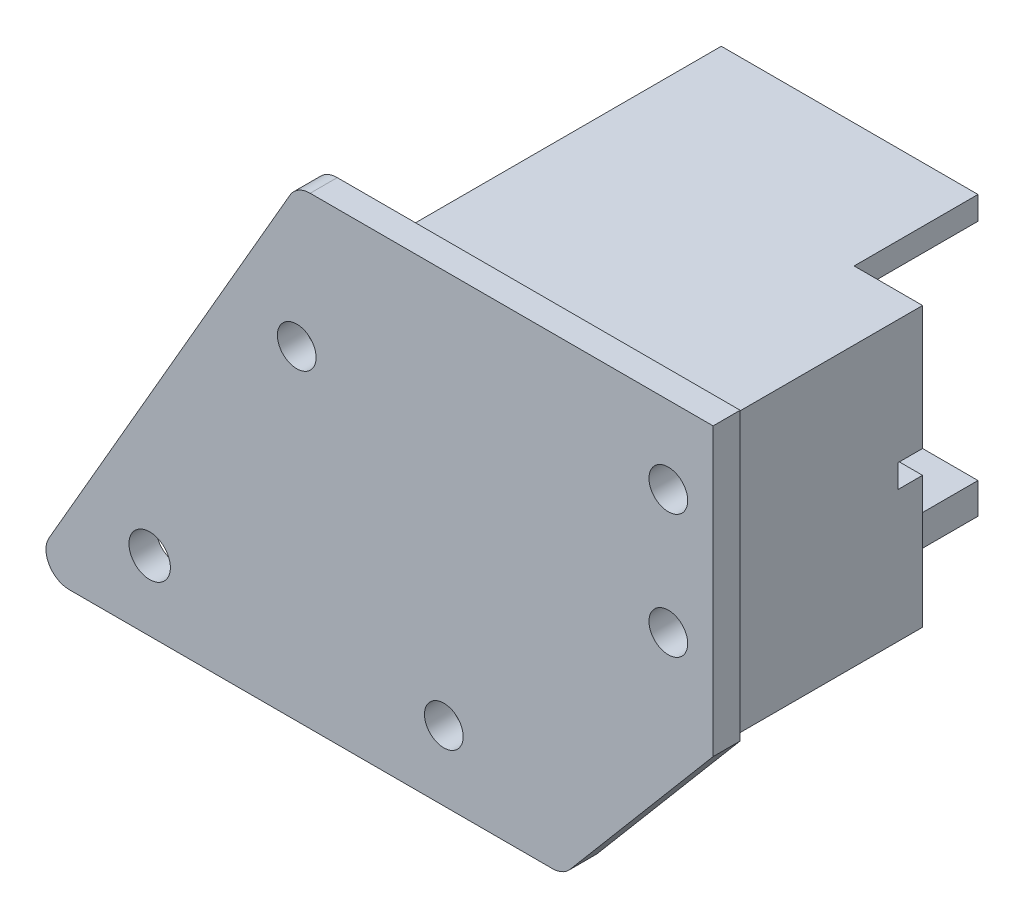
ISO-10303-21;
HEADER;
FILE_DESCRIPTION(('STEP AP214'),'2;1');
FILE_NAME('part.step','',(''),(''),'','','');
FILE_SCHEMA(('AUTOMOTIVE_DESIGN { 1 0 10303 214 1 1 1 1 }'));
ENDSEC;
DATA;
#1=APPLICATION_CONTEXT('core data for automotive mechanical design processes');
#2=APPLICATION_PROTOCOL_DEFINITION('international standard','automotive_design',2000,#1);
#3=PRODUCT_CONTEXT('',#1,'mechanical');
#4=PRODUCT('Part','Part','',(#3));
#5=PRODUCT_RELATED_PRODUCT_CATEGORY('part','',(#4));
#6=PRODUCT_DEFINITION_FORMATION('','',#4);
#7=PRODUCT_DEFINITION_CONTEXT('part definition',#1,'design');
#8=PRODUCT_DEFINITION('design','',#6,#7);
#9=PRODUCT_DEFINITION_SHAPE('','',#8);
#10=(LENGTH_UNIT() NAMED_UNIT(*) SI_UNIT(.MILLI.,.METRE.));
#11=(NAMED_UNIT(*) PLANE_ANGLE_UNIT() SI_UNIT($,.RADIAN.));
#12=(NAMED_UNIT(*) SI_UNIT($,.STERADIAN.) SOLID_ANGLE_UNIT());
#13=UNCERTAINTY_MEASURE_WITH_UNIT(LENGTH_MEASURE(1.E-05),#10,'distance_accuracy_value','');
#14=(GEOMETRIC_REPRESENTATION_CONTEXT(3) GLOBAL_UNCERTAINTY_ASSIGNED_CONTEXT((#13)) GLOBAL_UNIT_ASSIGNED_CONTEXT((#10,
#11,#12)) REPRESENTATION_CONTEXT('',''));
#15=CARTESIAN_POINT('',(0.,0.,0.));
#16=DIRECTION('',(0.,0.,1.));
#17=DIRECTION('',(1.,0.,0.));
#18=AXIS2_PLACEMENT_3D('',#15,#16,#17);
#19=CARTESIAN_POINT('',(46.3315186122816,0.,-24.));
#20=DIRECTION('',(1.,0.,0.));
#21=DIRECTION('',(0.,0.,-1.));
#22=AXIS2_PLACEMENT_3D('',#19,#20,#21);
#23=PLANE('',#22);
#24=DIRECTION('',(0.,1.,0.));
#25=VECTOR('',#24,1.);
#26=CARTESIAN_POINT('',(46.3315186122816,0.,-15.25));
#27=LINE('',#26,#25);
#28=CARTESIAN_POINT('',(46.3315186122816,18.4089653438087,-15.25));
#29=VERTEX_POINT('',#28);
#30=CARTESIAN_POINT('',(46.3315186122816,47.4089653438087,-15.25));
#31=VERTEX_POINT('',#30);
#32=EDGE_CURVE('E920',#29,#31,#27,.T.);
#33=ORIENTED_EDGE('',*,*,#32,.T.);
#34=DIRECTION('',(0.,0.,1.));
#35=VECTOR('',#34,1.);
#36=CARTESIAN_POINT('',(46.3315186122816,47.4089653438087,-24.));
#37=LINE('',#36,#35);
#38=CARTESIAN_POINT('',(46.3315186122816,47.4089653438087,-24.));
#39=VERTEX_POINT('',#38);
#40=EDGE_CURVE('E896',#39,#31,#37,.T.);
#41=ORIENTED_EDGE('',*,*,#40,.F.);
#42=DIRECTION('',(0.,1.,0.));
#43=VECTOR('',#42,1.);
#44=CARTESIAN_POINT('',(46.3315186122816,0.,-24.));
#45=LINE('',#44,#43);
#46=CARTESIAN_POINT('',(46.3315186122816,34.4089653438087,-24.));
#47=VERTEX_POINT('',#46);
#48=EDGE_CURVE('E875',#47,#39,#45,.T.);
#49=ORIENTED_EDGE('',*,*,#48,.F.);
#50=DIRECTION('',(0.,0.,1.));
#51=VECTOR('',#50,1.);
#52=CARTESIAN_POINT('',(46.3315186122816,34.4089653438087,-24.));
#53=LINE('',#52,#51);
#54=CARTESIAN_POINT('',(46.3315186122816,34.4089653438087,-20.8));
#55=VERTEX_POINT('',#54);
#56=EDGE_CURVE('E866',#47,#55,#53,.T.);
#57=ORIENTED_EDGE('',*,*,#56,.T.);
#58=DIRECTION('',(0.,-1.,0.));
#59=VECTOR('',#58,1.);
#60=CARTESIAN_POINT('',(46.3315186122816,0.,-20.8));
#61=LINE('',#60,#59);
#62=CARTESIAN_POINT('',(46.3315186122816,31.4089653438087,-20.8));
#63=VERTEX_POINT('',#62);
#64=EDGE_CURVE('E852',#55,#63,#61,.T.);
#65=ORIENTED_EDGE('',*,*,#64,.T.);
#66=DIRECTION('',(0.,0.,1.));
#67=VECTOR('',#66,1.);
#68=CARTESIAN_POINT('',(46.3315186122816,31.4089653438087,-24.));
#69=LINE('',#68,#67);
#70=CARTESIAN_POINT('',(46.3315186122816,31.4089653438087,-24.));
#71=VERTEX_POINT('',#70);
#72=EDGE_CURVE('E358',#71,#63,#69,.T.);
#73=ORIENTED_EDGE('',*,*,#72,.F.);
#74=DIRECTION('',(0.,1.,0.));
#75=VECTOR('',#74,1.);
#76=CARTESIAN_POINT('',(46.3315186122816,0.,-24.));
#77=LINE('',#76,#75);
#78=CARTESIAN_POINT('',(46.3315186122816,18.4089653438087,-24.));
#79=VERTEX_POINT('',#78);
#80=EDGE_CURVE('E348',#79,#71,#77,.T.);
#81=ORIENTED_EDGE('',*,*,#80,.F.);
#82=DIRECTION('',(0.,0.,1.));
#83=VECTOR('',#82,1.);
#84=CARTESIAN_POINT('',(46.3315186122816,18.4089653438087,-24.));
#85=LINE('',#84,#83);
#86=EDGE_CURVE('E361',#79,#29,#85,.T.);
#87=ORIENTED_EDGE('',*,*,#86,.T.);
#88=EDGE_LOOP('',(#33,#41,#49,#57,#65,#73,#81,#87));
#89=FACE_BOUND('',#88,.T.);
#90=ADVANCED_FACE('F154',(#89),#23,.F.);
#91=CARTESIAN_POINT('',(0.,47.4089653438087,-24.));
#92=DIRECTION('',(0.,-1.,0.));
#93=DIRECTION('',(0.,0.,-1.));
#94=AXIS2_PLACEMENT_3D('',#91,#92,#93);
#95=PLANE('',#94);
#96=ORIENTED_EDGE('',*,*,#40,.T.);
#97=DIRECTION('',(1.,0.,0.));
#98=VECTOR('',#97,1.);
#99=CARTESIAN_POINT('',(0.,47.4089653438087,-15.25));
#100=LINE('',#99,#98);
#101=CARTESIAN_POINT('',(13.1718698455063,47.4089653438087,-15.25));
#102=VERTEX_POINT('',#101);
#103=EDGE_CURVE('E921',#102,#31,#100,.T.);
#104=ORIENTED_EDGE('',*,*,#103,.F.);
#105=DIRECTION('',(0.,0.,1.));
#106=VECTOR('',#105,1.);
#107=CARTESIAN_POINT('',(13.1718698455063,47.4089653438087,-24.));
#108=LINE('',#107,#106);
#109=CARTESIAN_POINT('',(13.1718698455063,47.4089653438087,-40.));
#110=VERTEX_POINT('',#109);
#111=EDGE_CURVE('E884',#110,#102,#108,.T.);
#112=ORIENTED_EDGE('',*,*,#111,.F.);
#113=DIRECTION('',(-1.,0.,0.));
#114=VECTOR('',#113,1.);
#115=CARTESIAN_POINT('',(0.,47.4089653438087,-40.));
#116=LINE('',#115,#114);
#117=CARTESIAN_POINT('',(46.3315186122816,47.4089653438087,-40.));
#118=VERTEX_POINT('',#117);
#119=EDGE_CURVE('E928',#118,#110,#116,.T.);
#120=ORIENTED_EDGE('',*,*,#119,.F.);
#121=DIRECTION('',(0.,0.,1.));
#122=VECTOR('',#121,1.);
#123=CARTESIAN_POINT('',(46.3315186122816,47.4089653438087,-40.));
#124=LINE('',#123,#122);
#125=EDGE_CURVE('E926',#118,#39,#124,.T.);
#126=ORIENTED_EDGE('',*,*,#125,.T.);
#127=EDGE_LOOP('',(#96,#104,#112,#120,#126));
#128=FACE_BOUND('',#127,.T.);
#129=ADVANCED_FACE('F487',(#128),#95,.T.);
#130=CARTESIAN_POINT('',(0.,0.,-24.));
#131=DIRECTION('',(0.,0.,-1.));
#132=DIRECTION('',(-1.,0.,0.));
#133=AXIS2_PLACEMENT_3D('',#130,#131,#132);
#134=PLANE('',#133);
#135=CARTESIAN_POINT('',(49.8315186122816,24.9089653438087,-24.));
#136=DIRECTION('',(0.,0.,-1.));
#137=DIRECTION('',(-1.,0.,0.));
#138=AXIS2_PLACEMENT_3D('',#135,#136,#137);
#139=CIRCLE('',#138,2.5);
#140=CARTESIAN_POINT('',(47.3315186122816,24.9089653438087,-24.));
#141=VERTEX_POINT('',#140);
#142=EDGE_CURVE('E343',#141,#141,#139,.T.);
#143=ORIENTED_EDGE('',*,*,#142,.F.);
#144=EDGE_LOOP('',(#143));
#145=FACE_BOUND('',#144,.T.);
#146=DIRECTION('',(1.,0.,0.));
#147=VECTOR('',#146,1.);
#148=CARTESIAN_POINT('',(0.,14.4089653438087,-24.));
#149=LINE('',#148,#147);
#150=CARTESIAN_POINT('',(46.3315186122816,14.4089653438087,-24.));
#151=VERTEX_POINT('',#150);
#152=CARTESIAN_POINT('',(55.1718698455063,14.4089653438087,-24.));
#153=VERTEX_POINT('',#152);
#154=EDGE_CURVE('E177',#151,#153,#149,.T.);
#155=ORIENTED_EDGE('',*,*,#154,.F.);
#156=DIRECTION('',(0.,1.,0.));
#157=VECTOR('',#156,1.);
#158=CARTESIAN_POINT('',(46.3315186122816,0.,-24.));
#159=LINE('',#158,#157);
#160=EDGE_CURVE('E913',#151,#79,#159,.T.);
#161=ORIENTED_EDGE('',*,*,#160,.T.);
#162=ORIENTED_EDGE('',*,*,#80,.T.);
#163=DIRECTION('',(-1.,0.,0.));
#164=VECTOR('',#163,1.);
#165=CARTESIAN_POINT('',(0.,31.4089653438086,-24.));
#166=LINE('',#165,#164);
#167=CARTESIAN_POINT('',(55.1718698455064,31.4089653438087,-24.));
#168=VERTEX_POINT('',#167);
#169=EDGE_CURVE('E860',#168,#71,#166,.T.);
#170=ORIENTED_EDGE('',*,*,#169,.F.);
#171=DIRECTION('',(0.,1.,0.));
#172=VECTOR('',#171,1.);
#173=CARTESIAN_POINT('',(55.1718698455063,0.,-24.));
#174=LINE('',#173,#172);
#175=EDGE_CURVE('E904',#153,#168,#174,.T.);
#176=ORIENTED_EDGE('',*,*,#175,.F.);
#177=EDGE_LOOP('',(#155,#161,#162,#170,#176));
#178=FACE_BOUND('',#177,.T.);
#179=ADVANCED_FACE('F493',(#145,#178),#134,.T.);
#180=CARTESIAN_POINT('',(0.,0.,-24.));
#181=DIRECTION('',(0.,0.,1.));
#182=DIRECTION('',(1.,0.,0.));
#183=AXIS2_PLACEMENT_3D('',#180,#181,#182);
#184=PLANE('',#183);
#185=CARTESIAN_POINT('',(49.8315186122816,40.9089653438087,-24.));
#186=DIRECTION('',(0.,0.,-1.));
#187=DIRECTION('',(-1.,0.,0.));
#188=AXIS2_PLACEMENT_3D('',#185,#186,#187);
#189=CIRCLE('',#188,2.5);
#190=CARTESIAN_POINT('',(47.3315186122816,40.9089653438087,-24.));
#191=VERTEX_POINT('',#190);
#192=EDGE_CURVE('E324',#191,#191,#189,.T.);
#193=ORIENTED_EDGE('',*,*,#192,.F.);
#194=EDGE_LOOP('',(#193));
#195=FACE_BOUND('',#194,.T.);
#196=DIRECTION('',(0.,-1.,0.));
#197=VECTOR('',#196,1.);
#198=CARTESIAN_POINT('',(46.3315186122816,0.,-24.));
#199=LINE('',#198,#197);
#200=CARTESIAN_POINT('',(46.3315186122816,50.4089653438087,-24.));
#201=VERTEX_POINT('',#200);
#202=EDGE_CURVE('E935',#201,#39,#199,.T.);
#203=ORIENTED_EDGE('',*,*,#202,.F.);
#204=DIRECTION('',(1.,0.,0.));
#205=VECTOR('',#204,1.);
#206=CARTESIAN_POINT('',(0.,50.4089653438087,-24.));
#207=LINE('',#206,#205);
#208=CARTESIAN_POINT('',(55.1718698455063,50.4089653438087,-24.));
#209=VERTEX_POINT('',#208);
#210=EDGE_CURVE('E883',#201,#209,#207,.T.);
#211=ORIENTED_EDGE('',*,*,#210,.T.);
#212=DIRECTION('',(0.,1.,0.));
#213=VECTOR('',#212,1.);
#214=CARTESIAN_POINT('',(55.1718698455063,0.,-24.));
#215=LINE('',#214,#213);
#216=CARTESIAN_POINT('',(55.1718698455063,34.4089653438087,-24.));
#217=VERTEX_POINT('',#216);
#218=EDGE_CURVE('E880',#217,#209,#215,.T.);
#219=ORIENTED_EDGE('',*,*,#218,.F.);
#220=DIRECTION('',(-1.,0.,0.));
#221=VECTOR('',#220,1.);
#222=CARTESIAN_POINT('',(0.,34.4089653438087,-24.));
#223=LINE('',#222,#221);
#224=EDGE_CURVE('E878',#217,#47,#223,.T.);
#225=ORIENTED_EDGE('',*,*,#224,.T.);
#226=ORIENTED_EDGE('',*,*,#48,.T.);
#227=EDGE_LOOP('',(#203,#211,#219,#225,#226));
#228=FACE_BOUND('',#227,.T.);
#229=ADVANCED_FACE('F520',(#195,#228),#184,.F.);
#230=CARTESIAN_POINT('',(0.,0.,0.));
#231=DIRECTION('',(0.,0.,-1.));
#232=DIRECTION('',(-1.,0.,0.));
#233=AXIS2_PLACEMENT_3D('',#230,#231,#232);
#234=PLANE('',#233);
#235=DIRECTION('',(0.,-1.,0.));
#236=VECTOR('',#235,1.);
#237=CARTESIAN_POINT('',(13.1718698455062,0.,0.));
#238=LINE('',#237,#236);
#239=CARTESIAN_POINT('',(13.1718698455063,50.4089653438087,0.));
#240=VERTEX_POINT('',#239);
#241=CARTESIAN_POINT('',(13.1718698455063,18.4089653438087,0.));
#242=VERTEX_POINT('',#241);
#243=EDGE_CURVE('E313',#240,#242,#238,.T.);
#244=ORIENTED_EDGE('',*,*,#243,.T.);
#245=DIRECTION('',(1.,0.,0.));
#246=VECTOR('',#245,1.);
#247=CARTESIAN_POINT('',(0.,18.4089653438087,0.));
#248=LINE('',#247,#246);
#249=CARTESIAN_POINT('',(-11.9230469493868,18.4089653438087,0.));
#250=VERTEX_POINT('',#249);
#251=EDGE_CURVE('E318',#250,#242,#248,.T.);
#252=ORIENTED_EDGE('',*,*,#251,.F.);
#253=DIRECTION('',(0.,1.,0.));
#254=VECTOR('',#253,1.);
#255=CARTESIAN_POINT('',(-11.9230469493868,0.,0.));
#256=LINE('',#255,#254);
#257=CARTESIAN_POINT('',(-11.9230469493868,14.4089653438087,0.));
#258=VERTEX_POINT('',#257);
#259=EDGE_CURVE('E339',#258,#250,#256,.T.);
#260=ORIENTED_EDGE('',*,*,#259,.F.);
#261=DIRECTION('',(1.,0.,0.));
#262=VECTOR('',#261,1.);
#263=CARTESIAN_POINT('',(0.,14.4089653438087,0.));
#264=LINE('',#263,#262);
#265=CARTESIAN_POINT('',(55.1718698455063,14.4089653438087,0.));
#266=VERTEX_POINT('',#265);
#267=EDGE_CURVE('E341',#258,#266,#264,.T.);
#268=ORIENTED_EDGE('',*,*,#267,.T.);
#269=DIRECTION('',(0.,1.,0.));
#270=VECTOR('',#269,1.);
#271=CARTESIAN_POINT('',(55.1718698455063,0.,0.));
#272=LINE('',#271,#270);
#273=CARTESIAN_POINT('',(55.1718698455063,50.4089653438087,0.));
#274=VERTEX_POINT('',#273);
#275=EDGE_CURVE('E338',#266,#274,#272,.T.);
#276=ORIENTED_EDGE('',*,*,#275,.T.);
#277=DIRECTION('',(1.,0.,0.));
#278=VECTOR('',#277,1.);
#279=CARTESIAN_POINT('',(0.,50.4089653438087,0.));
#280=LINE('',#279,#278);
#281=EDGE_CURVE('E321',#240,#274,#280,.T.);
#282=ORIENTED_EDGE('',*,*,#281,.F.);
#283=EDGE_LOOP('',(#244,#252,#260,#268,#276,#282));
#284=FACE_BOUND('',#283,.T.);
#285=CARTESIAN_POINT('',(-27.5607862331316,-6.00000000000001,0.));
#286=DIRECTION('',(0.,0.,-1.));
#287=DIRECTION('',(-1.,0.,0.));
#288=AXIS2_PLACEMENT_3D('',#285,#286,#287);
#289=CIRCLE('',#288,3.);
#290=CARTESIAN_POINT('',(-27.5607862331316,-9.00000000000001,0.));
#291=VERTEX_POINT('',#290);
#292=CARTESIAN_POINT('',(-30.158862444485,-4.50000000000001,0.));
#293=VERTEX_POINT('',#292);
#294=EDGE_CURVE('E419',#291,#293,#289,.T.);
#295=ORIENTED_EDGE('',*,*,#294,.T.);
#296=DIRECTION('',(-0.5,-0.866025403784439,0.));
#297=VECTOR('',#296,1.);
#298=CARTESIAN_POINT('',(1.83151861228162,50.9089653438087,0.));
#299=LINE('',#298,#297);
#300=CARTESIAN_POINT('',(0.965493208497183,49.4089653438087,0.));
#301=VERTEX_POINT('',#300);
#302=EDGE_CURVE('E400',#301,#293,#299,.T.);
#303=ORIENTED_EDGE('',*,*,#302,.F.);
#304=CARTESIAN_POINT('',(3.5635694198505,47.9089653438087,0.));
#305=DIRECTION('',(0.,0.,-1.));
#306=DIRECTION('',(-1.,0.,0.));
#307=AXIS2_PLACEMENT_3D('',#304,#305,#306);
#308=CIRCLE('',#307,3.);
#309=CARTESIAN_POINT('',(3.56356941985051,50.9089653438087,0.));
#310=VERTEX_POINT('',#309);
#311=EDGE_CURVE('E424',#301,#310,#308,.T.);
#312=ORIENTED_EDGE('',*,*,#311,.T.);
#313=DIRECTION('',(-1.,0.,0.));
#314=VECTOR('',#313,1.);
#315=CARTESIAN_POINT('',(55.6126072055435,50.9089653438087,0.));
#316=LINE('',#315,#314);
#317=CARTESIAN_POINT('',(55.6126072055435,50.9089653438087,0.));
#318=VERTEX_POINT('',#317);
#319=EDGE_CURVE('E381',#318,#310,#316,.T.);
#320=ORIENTED_EDGE('',*,*,#319,.F.);
#321=DIRECTION('',(0.,1.,0.));
#322=VECTOR('',#321,1.);
#323=CARTESIAN_POINT('',(55.6126072055435,13.9089653438087,0.));
#324=LINE('',#323,#322);
#325=CARTESIAN_POINT('',(55.6126072055435,13.9089653438087,0.));
#326=VERTEX_POINT('',#325);
#327=EDGE_CURVE('E388',#326,#318,#324,.T.);
#328=ORIENTED_EDGE('',*,*,#327,.F.);
#329=DIRECTION('',(0.645651528712727,0.763632178126956,0.));
#330=VECTOR('',#329,1.);
#331=CARTESIAN_POINT('',(36.2430613441617,-9.,0.));
#332=LINE('',#331,#330);
#333=CARTESIAN_POINT('',(37.1418669684015,-7.93695458613818,0.));
#334=VERTEX_POINT('',#333);
#335=EDGE_CURVE('E405',#334,#326,#332,.T.);
#336=ORIENTED_EDGE('',*,*,#335,.F.);
#337=CARTESIAN_POINT('',(34.8509704340206,-6.,0.));
#338=DIRECTION('',(0.,0.,-1.));
#339=DIRECTION('',(-1.,0.,0.));
#340=AXIS2_PLACEMENT_3D('',#337,#338,#339);
#341=CIRCLE('',#340,3.);
#342=CARTESIAN_POINT('',(34.8509704340206,-9.,0.));
#343=VERTEX_POINT('',#342);
#344=EDGE_CURVE('E422',#334,#343,#341,.T.);
#345=ORIENTED_EDGE('',*,*,#344,.T.);
#346=DIRECTION('',(1.,0.,0.));
#347=VECTOR('',#346,1.);
#348=CARTESIAN_POINT('',(-32.7569386558383,-9.00000000000001,0.));
#349=LINE('',#348,#347);
#350=EDGE_CURVE('E402',#291,#343,#349,.T.);
#351=ORIENTED_EDGE('',*,*,#350,.F.);
#352=EDGE_LOOP('',(#295,#303,#312,#320,#328,#336,#345,#351));
#353=FACE_BOUND('',#352,.T.);
#354=CARTESIAN_POINT('',(20.8315186122816,0.,0.));
#355=DIRECTION('',(0.,0.,1.));
#356=DIRECTION('',(1.,0.,0.));
#357=AXIS2_PLACEMENT_3D('',#354,#355,#356);
#358=CIRCLE('',#357,2.5);
#359=CARTESIAN_POINT('',(23.3315186122816,0.,0.));
#360=VERTEX_POINT('',#359);
#361=EDGE_CURVE('E369',#360,#360,#358,.T.);
#362=ORIENTED_EDGE('',*,*,#361,.T.);
#363=EDGE_LOOP('',(#362));
#364=FACE_BOUND('',#363,.T.);
#365=CARTESIAN_POINT('',(-17.1684813877184,0.,0.));
#366=DIRECTION('',(0.,0.,1.));
#367=DIRECTION('',(1.,0.,0.));
#368=AXIS2_PLACEMENT_3D('',#365,#366,#367);
#369=CIRCLE('',#368,2.675);
#370=CARTESIAN_POINT('',(-14.4934813877184,0.,0.));
#371=VERTEX_POINT('',#370);
#372=EDGE_CURVE('E375',#371,#371,#369,.T.);
#373=ORIENTED_EDGE('',*,*,#372,.T.);
#374=EDGE_LOOP('',(#373));
#375=FACE_BOUND('',#374,.T.);
#376=CARTESIAN_POINT('',(1.83151861228162,32.9089653438087,0.));
#377=DIRECTION('',(0.,0.,1.));
#378=DIRECTION('',(1.,0.,0.));
#379=AXIS2_PLACEMENT_3D('',#376,#377,#378);
#380=CIRCLE('',#379,2.5);
#381=CARTESIAN_POINT('',(4.33151861228162,32.9089653438087,0.));
#382=VERTEX_POINT('',#381);
#383=EDGE_CURVE('E365',#382,#382,#380,.T.);
#384=ORIENTED_EDGE('',*,*,#383,.T.);
#385=EDGE_LOOP('',(#384));
#386=FACE_BOUND('',#385,.T.);
#387=ADVANCED_FACE('F315',(#284,#353,#364,#375,#386),#234,.T.);
#388=CARTESIAN_POINT('',(0.,0.,3.5));
#389=DIRECTION('',(0.,0.,-1.));
#390=DIRECTION('',(-1.,0.,0.));
#391=AXIS2_PLACEMENT_3D('',#388,#389,#390);
#392=PLANE('',#391);
#393=CARTESIAN_POINT('',(49.8315186122816,24.9089653438087,3.5));
#394=DIRECTION('',(0.,0.,-1.));
#395=DIRECTION('',(-1.,0.,0.));
#396=AXIS2_PLACEMENT_3D('',#393,#394,#395);
#397=CIRCLE('',#396,2.5);
#398=CARTESIAN_POINT('',(47.3315186122816,24.9089653438087,3.5));
#399=VERTEX_POINT('',#398);
#400=EDGE_CURVE('E962',#399,#399,#397,.T.);
#401=ORIENTED_EDGE('',*,*,#400,.T.);
#402=EDGE_LOOP('',(#401));
#403=FACE_BOUND('',#402,.T.);
#404=CARTESIAN_POINT('',(49.8315186122816,40.9089653438087,3.5));
#405=DIRECTION('',(0.,0.,-1.));
#406=DIRECTION('',(-1.,0.,0.));
#407=AXIS2_PLACEMENT_3D('',#404,#405,#406);
#408=CIRCLE('',#407,2.5);
#409=CARTESIAN_POINT('',(47.3315186122816,40.9089653438087,3.5));
#410=VERTEX_POINT('',#409);
#411=EDGE_CURVE('E855',#410,#410,#408,.T.);
#412=ORIENTED_EDGE('',*,*,#411,.T.);
#413=EDGE_LOOP('',(#412));
#414=FACE_BOUND('',#413,.T.);
#415=DIRECTION('',(-0.5,-0.866025403784439,0.));
#416=VECTOR('',#415,1.);
#417=CARTESIAN_POINT('',(1.83151861228162,50.9089653438087,3.5));
#418=LINE('',#417,#416);
#419=CARTESIAN_POINT('',(0.965493208497183,49.4089653438087,3.5));
#420=VERTEX_POINT('',#419);
#421=CARTESIAN_POINT('',(-30.158862444485,-4.50000000000001,3.5));
#422=VERTEX_POINT('',#421);
#423=EDGE_CURVE('E387',#420,#422,#418,.T.);
#424=ORIENTED_EDGE('',*,*,#423,.T.);
#425=CARTESIAN_POINT('',(-27.5607862331316,-6.00000000000001,3.5));
#426=DIRECTION('',(0.,0.,-1.));
#427=DIRECTION('',(-1.,0.,0.));
#428=AXIS2_PLACEMENT_3D('',#425,#426,#427);
#429=CIRCLE('',#428,3.);
#430=CARTESIAN_POINT('',(-27.5607862331316,-9.00000000000001,3.5));
#431=VERTEX_POINT('',#430);
#432=EDGE_CURVE('E428',#422,#431,#429,.F.);
#433=ORIENTED_EDGE('',*,*,#432,.T.);
#434=DIRECTION('',(1.,0.,0.));
#435=VECTOR('',#434,1.);
#436=CARTESIAN_POINT('',(-32.7569386558383,-9.00000000000001,3.5));
#437=LINE('',#436,#435);
#438=CARTESIAN_POINT('',(34.8509704340206,-9.,3.5));
#439=VERTEX_POINT('',#438);
#440=EDGE_CURVE('E390',#431,#439,#437,.T.);
#441=ORIENTED_EDGE('',*,*,#440,.T.);
#442=CARTESIAN_POINT('',(34.8509704340206,-6.,3.5));
#443=DIRECTION('',(0.,0.,-1.));
#444=DIRECTION('',(-1.,0.,0.));
#445=AXIS2_PLACEMENT_3D('',#442,#443,#444);
#446=CIRCLE('',#445,3.);
#447=CARTESIAN_POINT('',(37.1418669684015,-7.93695458613818,3.5));
#448=VERTEX_POINT('',#447);
#449=EDGE_CURVE('E430',#439,#448,#446,.F.);
#450=ORIENTED_EDGE('',*,*,#449,.T.);
#451=DIRECTION('',(0.645651528712727,0.763632178126956,0.));
#452=VECTOR('',#451,1.);
#453=CARTESIAN_POINT('',(36.2430613441617,-9.,3.5));
#454=LINE('',#453,#452);
#455=CARTESIAN_POINT('',(55.6126072055435,13.9089653438087,3.5));
#456=VERTEX_POINT('',#455);
#457=EDGE_CURVE('E393',#448,#456,#454,.T.);
#458=ORIENTED_EDGE('',*,*,#457,.T.);
#459=DIRECTION('',(0.,1.,0.));
#460=VECTOR('',#459,1.);
#461=CARTESIAN_POINT('',(55.6126072055435,13.9089653438087,3.5));
#462=LINE('',#461,#460);
#463=CARTESIAN_POINT('',(55.6126072055435,50.9089653438087,3.5));
#464=VERTEX_POINT('',#463);
#465=EDGE_CURVE('E395',#456,#464,#462,.T.);
#466=ORIENTED_EDGE('',*,*,#465,.T.);
#467=DIRECTION('',(-1.,0.,0.));
#468=VECTOR('',#467,1.);
#469=CARTESIAN_POINT('',(55.6126072055435,50.9089653438087,3.5));
#470=LINE('',#469,#468);
#471=CARTESIAN_POINT('',(3.56356941985051,50.9089653438087,3.5));
#472=VERTEX_POINT('',#471);
#473=EDGE_CURVE('E384',#464,#472,#470,.T.);
#474=ORIENTED_EDGE('',*,*,#473,.T.);
#475=CARTESIAN_POINT('',(3.5635694198505,47.9089653438087,3.5));
#476=DIRECTION('',(0.,0.,-1.));
#477=DIRECTION('',(-1.,0.,0.));
#478=AXIS2_PLACEMENT_3D('',#475,#476,#477);
#479=CIRCLE('',#478,3.);
#480=EDGE_CURVE('E432',#472,#420,#479,.F.);
#481=ORIENTED_EDGE('',*,*,#480,.T.);
#482=EDGE_LOOP('',(#424,#433,#441,#450,#458,#466,#474,#481));
#483=FACE_BOUND('',#482,.T.);
#484=CARTESIAN_POINT('',(1.83151861228162,32.9089653438087,3.5));
#485=DIRECTION('',(0.,0.,1.));
#486=DIRECTION('',(1.,0.,0.));
#487=AXIS2_PLACEMENT_3D('',#484,#485,#486);
#488=CIRCLE('',#487,2.5);
#489=CARTESIAN_POINT('',(4.33151861228162,32.9089653438087,3.5));
#490=VERTEX_POINT('',#489);
#491=EDGE_CURVE('E366',#490,#490,#488,.T.);
#492=ORIENTED_EDGE('',*,*,#491,.F.);
#493=EDGE_LOOP('',(#492));
#494=FACE_BOUND('',#493,.T.);
#495=CARTESIAN_POINT('',(20.8315186122816,0.,3.5));
#496=DIRECTION('',(0.,0.,1.));
#497=DIRECTION('',(1.,0.,0.));
#498=AXIS2_PLACEMENT_3D('',#495,#496,#497);
#499=CIRCLE('',#498,2.5);
#500=CARTESIAN_POINT('',(23.3315186122816,0.,3.5));
#501=VERTEX_POINT('',#500);
#502=EDGE_CURVE('E372',#501,#501,#499,.T.);
#503=ORIENTED_EDGE('',*,*,#502,.F.);
#504=EDGE_LOOP('',(#503));
#505=FACE_BOUND('',#504,.T.);
#506=CARTESIAN_POINT('',(-17.1684813877184,0.,3.5));
#507=DIRECTION('',(0.,0.,1.));
#508=DIRECTION('',(1.,0.,0.));
#509=AXIS2_PLACEMENT_3D('',#506,#507,#508);
#510=CIRCLE('',#509,2.675);
#511=CARTESIAN_POINT('',(-14.4934813877184,0.,3.5));
#512=VERTEX_POINT('',#511);
#513=EDGE_CURVE('E378',#512,#512,#510,.T.);
#514=ORIENTED_EDGE('',*,*,#513,.F.);
#515=EDGE_LOOP('',(#514));
#516=FACE_BOUND('',#515,.T.);
#517=ADVANCED_FACE('F460',(#403,#414,#483,#494,#505,#516),#392,.F.);
#518=CARTESIAN_POINT('',(55.6126072055435,50.9089653438087,3.5));
#519=DIRECTION('',(0.,-1.,0.));
#520=DIRECTION('',(1.,0.,0.));
#521=AXIS2_PLACEMENT_3D('',#518,#519,#520);
#522=PLANE('',#521);
#523=ORIENTED_EDGE('',*,*,#319,.T.);
#524=DIRECTION('',(0.,0.,-1.));
#525=VECTOR('',#524,1.);
#526=CARTESIAN_POINT('',(3.5635694198505,50.9089653438087,3.5));
#527=LINE('',#526,#525);
#528=EDGE_CURVE('E426',#310,#472,#527,.F.);
#529=ORIENTED_EDGE('',*,*,#528,.T.);
#530=ORIENTED_EDGE('',*,*,#473,.F.);
#531=DIRECTION('',(0.,0.,-1.));
#532=VECTOR('',#531,1.);
#533=CARTESIAN_POINT('',(55.6126072055435,50.9089653438087,3.5));
#534=LINE('',#533,#532);
#535=EDGE_CURVE('E397',#464,#318,#534,.T.);
#536=ORIENTED_EDGE('',*,*,#535,.T.);
#537=EDGE_LOOP('',(#523,#529,#530,#536));
#538=FACE_BOUND('',#537,.T.);
#539=ADVANCED_FACE('F471',(#538),#522,.F.);
#540=CARTESIAN_POINT('',(1.83151861228162,50.9089653438087,3.5));
#541=DIRECTION('',(0.866025403784439,-0.5,0.));
#542=DIRECTION('',(0.5,0.866025403784439,0.));
#543=AXIS2_PLACEMENT_3D('',#540,#541,#542);
#544=PLANE('',#543);
#545=DIRECTION('',(0.,0.,-1.));
#546=VECTOR('',#545,1.);
#547=CARTESIAN_POINT('',(-30.158862444485,-4.50000000000001,3.5));
#548=LINE('',#547,#546);
#549=EDGE_CURVE('E413',#293,#422,#548,.F.);
#550=ORIENTED_EDGE('',*,*,#549,.T.);
#551=ORIENTED_EDGE('',*,*,#423,.F.);
#552=DIRECTION('',(0.,0.,-1.));
#553=VECTOR('',#552,1.);
#554=CARTESIAN_POINT('',(0.965493208497183,49.4089653438087,3.5));
#555=LINE('',#554,#553);
#556=EDGE_CURVE('E416',#420,#301,#555,.T.);
#557=ORIENTED_EDGE('',*,*,#556,.T.);
#558=ORIENTED_EDGE('',*,*,#302,.T.);
#559=EDGE_LOOP('',(#550,#551,#557,#558));
#560=FACE_BOUND('',#559,.T.);
#561=ADVANCED_FACE('F465',(#560),#544,.F.);
#562=CARTESIAN_POINT('',(-32.7569386558383,-9.00000000000001,3.5));
#563=DIRECTION('',(0.,1.,0.));
#564=DIRECTION('',(-1.,0.,0.));
#565=AXIS2_PLACEMENT_3D('',#562,#563,#564);
#566=PLANE('',#565);
#567=ORIENTED_EDGE('',*,*,#350,.T.);
#568=DIRECTION('',(0.,0.,-1.));
#569=VECTOR('',#568,1.);
#570=CARTESIAN_POINT('',(34.8509704340206,-9.,3.5));
#571=LINE('',#570,#569);
#572=EDGE_CURVE('E13',#343,#439,#571,.F.);
#573=ORIENTED_EDGE('',*,*,#572,.T.);
#574=ORIENTED_EDGE('',*,*,#440,.F.);
#575=DIRECTION('',(0.,0.,-1.));
#576=VECTOR('',#575,1.);
#577=CARTESIAN_POINT('',(-27.5607862331316,-9.00000000000001,3.5));
#578=LINE('',#577,#576);
#579=EDGE_CURVE('E162',#431,#291,#578,.T.);
#580=ORIENTED_EDGE('',*,*,#579,.T.);
#581=EDGE_LOOP('',(#567,#573,#574,#580));
#582=FACE_BOUND('',#581,.T.);
#583=ADVANCED_FACE('F441',(#582),#566,.F.);
#584=CARTESIAN_POINT('',(36.2430613441617,-9.,3.5));
#585=DIRECTION('',(-0.763632178126956,0.645651528712727,0.));
#586=DIRECTION('',(-0.645651528712727,-0.763632178126956,0.));
#587=AXIS2_PLACEMENT_3D('',#584,#585,#586);
#588=PLANE('',#587);
#589=ORIENTED_EDGE('',*,*,#457,.F.);
#590=DIRECTION('',(0.,0.,-1.));
#591=VECTOR('',#590,1.);
#592=CARTESIAN_POINT('',(37.1418669684015,-7.93695458613818,3.5));
#593=LINE('',#592,#591);
#594=EDGE_CURVE('E434',#448,#334,#593,.T.);
#595=ORIENTED_EDGE('',*,*,#594,.T.);
#596=ORIENTED_EDGE('',*,*,#335,.T.);
#597=DIRECTION('',(0.,0.,-1.));
#598=VECTOR('',#597,1.);
#599=CARTESIAN_POINT('',(55.6126072055435,13.9089653438087,3.5));
#600=LINE('',#599,#598);
#601=EDGE_CURVE('E410',#456,#326,#600,.T.);
#602=ORIENTED_EDGE('',*,*,#601,.F.);
#603=EDGE_LOOP('',(#589,#595,#596,#602));
#604=FACE_BOUND('',#603,.T.);
#605=ADVANCED_FACE('F456',(#604),#588,.F.);
#606=CARTESIAN_POINT('',(55.6126072055435,13.9089653438087,3.5));
#607=DIRECTION('',(-1.,0.,0.));
#608=DIRECTION('',(0.,0.,1.));
#609=AXIS2_PLACEMENT_3D('',#606,#607,#608);
#610=PLANE('',#609);
#611=ORIENTED_EDGE('',*,*,#327,.T.);
#612=ORIENTED_EDGE('',*,*,#535,.F.);
#613=ORIENTED_EDGE('',*,*,#465,.F.);
#614=ORIENTED_EDGE('',*,*,#601,.T.);
#615=EDGE_LOOP('',(#611,#612,#613,#614));
#616=FACE_BOUND('',#615,.T.);
#617=ADVANCED_FACE('F513',(#616),#610,.F.);
#618=CARTESIAN_POINT('',(-17.1684813877184,0.,3.5));
#619=DIRECTION('',(0.,0.,-1.));
#620=DIRECTION('',(-1.,0.,0.));
#621=AXIS2_PLACEMENT_3D('',#618,#619,#620);
#622=CYLINDRICAL_SURFACE('',#621,2.675);
#623=ORIENTED_EDGE('',*,*,#513,.T.);
#624=EDGE_LOOP('',(#623));
#625=FACE_BOUND('',#624,.T.);
#626=ORIENTED_EDGE('',*,*,#372,.F.);
#627=EDGE_LOOP('',(#626));
#628=FACE_BOUND('',#627,.T.);
#629=ADVANCED_FACE('F509',(#625,#628),#622,.F.);
#630=CARTESIAN_POINT('',(20.8315186122816,0.,3.5));
#631=DIRECTION('',(0.,0.,-1.));
#632=DIRECTION('',(-1.,0.,0.));
#633=AXIS2_PLACEMENT_3D('',#630,#631,#632);
#634=CYLINDRICAL_SURFACE('',#633,2.5);
#635=ORIENTED_EDGE('',*,*,#502,.T.);
#636=EDGE_LOOP('',(#635));
#637=FACE_BOUND('',#636,.T.);
#638=ORIENTED_EDGE('',*,*,#361,.F.);
#639=EDGE_LOOP('',(#638));
#640=FACE_BOUND('',#639,.T.);
#641=ADVANCED_FACE('F482',(#637,#640),#634,.F.);
#642=CARTESIAN_POINT('',(1.83151861228162,32.9089653438087,3.5));
#643=DIRECTION('',(0.,0.,-1.));
#644=DIRECTION('',(-1.,0.,0.));
#645=AXIS2_PLACEMENT_3D('',#642,#643,#644);
#646=CYLINDRICAL_SURFACE('',#645,2.5);
#647=ORIENTED_EDGE('',*,*,#491,.T.);
#648=EDGE_LOOP('',(#647));
#649=FACE_BOUND('',#648,.T.);
#650=ORIENTED_EDGE('',*,*,#383,.F.);
#651=EDGE_LOOP('',(#650));
#652=FACE_BOUND('',#651,.T.);
#653=ADVANCED_FACE('F476',(#649,#652),#646,.F.);
#654=CARTESIAN_POINT('',(3.5635694198505,47.9089653438087,3.5));
#655=DIRECTION('',(0.,0.,-1.));
#656=DIRECTION('',(-1.,0.,0.));
#657=AXIS2_PLACEMENT_3D('',#654,#655,#656);
#658=CYLINDRICAL_SURFACE('',#657,3.);
#659=ORIENTED_EDGE('',*,*,#480,.F.);
#660=ORIENTED_EDGE('',*,*,#528,.F.);
#661=ORIENTED_EDGE('',*,*,#311,.F.);
#662=ORIENTED_EDGE('',*,*,#556,.F.);
#663=EDGE_LOOP('',(#659,#660,#661,#662));
#664=FACE_BOUND('',#663,.T.);
#665=ADVANCED_FACE('F474',(#664),#658,.T.);
#666=CARTESIAN_POINT('',(34.8509704340206,-6.,3.5));
#667=DIRECTION('',(0.,0.,-1.));
#668=DIRECTION('',(-1.,0.,0.));
#669=AXIS2_PLACEMENT_3D('',#666,#667,#668);
#670=CYLINDRICAL_SURFACE('',#669,3.);
#671=ORIENTED_EDGE('',*,*,#449,.F.);
#672=ORIENTED_EDGE('',*,*,#572,.F.);
#673=ORIENTED_EDGE('',*,*,#344,.F.);
#674=ORIENTED_EDGE('',*,*,#594,.F.);
#675=EDGE_LOOP('',(#671,#672,#673,#674));
#676=FACE_BOUND('',#675,.T.);
#677=ADVANCED_FACE('F453',(#676),#670,.T.);
#678=CARTESIAN_POINT('',(-27.5607862331316,-6.00000000000001,3.5));
#679=DIRECTION('',(0.,0.,-1.));
#680=DIRECTION('',(-1.,0.,0.));
#681=AXIS2_PLACEMENT_3D('',#678,#679,#680);
#682=CYLINDRICAL_SURFACE('',#681,3.);
#683=ORIENTED_EDGE('',*,*,#432,.F.);
#684=ORIENTED_EDGE('',*,*,#549,.F.);
#685=ORIENTED_EDGE('',*,*,#294,.F.);
#686=ORIENTED_EDGE('',*,*,#579,.F.);
#687=EDGE_LOOP('',(#683,#684,#685,#686));
#688=FACE_BOUND('',#687,.T.);
#689=ADVANCED_FACE('F156',(#688),#682,.T.);
#690=CARTESIAN_POINT('',(-11.9230469493868,0.,-24.));
#691=DIRECTION('',(1.,0.,0.));
#692=DIRECTION('',(0.,0.,-1.));
#693=AXIS2_PLACEMENT_3D('',#690,#691,#692);
#694=PLANE('',#693);
#695=ORIENTED_EDGE('',*,*,#259,.T.);
#696=DIRECTION('',(0.,0.,1.));
#697=VECTOR('',#696,1.);
#698=CARTESIAN_POINT('',(-11.9230469493868,18.4089653438087,-24.));
#699=LINE('',#698,#697);
#700=CARTESIAN_POINT('',(-11.9230469493868,18.4089653438087,-40.));
#701=VERTEX_POINT('',#700);
#702=EDGE_CURVE('E336',#701,#250,#699,.T.);
#703=ORIENTED_EDGE('',*,*,#702,.F.);
#704=DIRECTION('',(0.,-1.,0.));
#705=VECTOR('',#704,1.);
#706=CARTESIAN_POINT('',(-11.9230469493868,0.,-40.));
#707=LINE('',#706,#705);
#708=CARTESIAN_POINT('',(-11.9230469493868,14.4089653438087,-40.));
#709=VERTEX_POINT('',#708);
#710=EDGE_CURVE('E946',#701,#709,#707,.T.);
#711=ORIENTED_EDGE('',*,*,#710,.T.);
#712=DIRECTION('',(0.,0.,1.));
#713=VECTOR('',#712,1.);
#714=CARTESIAN_POINT('',(-11.9230469493868,14.4089653438087,-24.));
#715=LINE('',#714,#713);
#716=EDGE_CURVE('E349',#709,#258,#715,.T.);
#717=ORIENTED_EDGE('',*,*,#716,.T.);
#718=EDGE_LOOP('',(#695,#703,#711,#717));
#719=FACE_BOUND('',#718,.T.);
#720=ADVANCED_FACE('F503',(#719),#694,.F.);
#721=CARTESIAN_POINT('',(0.,18.4089653438087,-24.));
#722=DIRECTION('',(0.,-1.,0.));
#723=DIRECTION('',(0.,0.,-1.));
#724=AXIS2_PLACEMENT_3D('',#721,#722,#723);
#725=PLANE('',#724);
#726=ORIENTED_EDGE('',*,*,#251,.T.);
#727=DIRECTION('',(0.,0.,1.));
#728=VECTOR('',#727,1.);
#729=CARTESIAN_POINT('',(13.1718698455063,18.4089653438087,-68.0518138824714));
#730=LINE('',#729,#728);
#731=CARTESIAN_POINT('',(13.1718698455063,18.4089653438087,-15.25));
#732=VERTEX_POINT('',#731);
#733=EDGE_CURVE('E327',#732,#242,#730,.T.);
#734=ORIENTED_EDGE('',*,*,#733,.F.);
#735=DIRECTION('',(1.,0.,0.));
#736=VECTOR('',#735,1.);
#737=CARTESIAN_POINT('',(0.,18.4089653438087,-15.25));
#738=LINE('',#737,#736);
#739=EDGE_CURVE('E332',#732,#29,#738,.T.);
#740=ORIENTED_EDGE('',*,*,#739,.T.);
#741=ORIENTED_EDGE('',*,*,#86,.F.);
#742=DIRECTION('',(0.,0.,1.));
#743=VECTOR('',#742,1.);
#744=CARTESIAN_POINT('',(46.3315186122816,18.4089653438087,-40.));
#745=LINE('',#744,#743);
#746=CARTESIAN_POINT('',(46.3315186122816,18.4089653438087,-40.));
#747=VERTEX_POINT('',#746);
#748=EDGE_CURVE('E916',#747,#79,#745,.T.);
#749=ORIENTED_EDGE('',*,*,#748,.F.);
#750=DIRECTION('',(-1.,0.,0.));
#751=VECTOR('',#750,1.);
#752=CARTESIAN_POINT('',(0.,18.4089653438087,-40.));
#753=LINE('',#752,#751);
#754=EDGE_CURVE('E972',#747,#701,#753,.T.);
#755=ORIENTED_EDGE('',*,*,#754,.T.);
#756=ORIENTED_EDGE('',*,*,#702,.T.);
#757=EDGE_LOOP('',(#726,#734,#740,#741,#749,#755,#756));
#758=FACE_BOUND('',#757,.T.);
#759=ADVANCED_FACE('F334',(#758),#725,.F.);
#760=CARTESIAN_POINT('',(0.,31.4089653438086,-24.));
#761=DIRECTION('',(0.,1.,0.));
#762=DIRECTION('',(-1.,0.,0.));
#763=AXIS2_PLACEMENT_3D('',#760,#761,#762);
#764=PLANE('',#763);
#765=DIRECTION('',(1.,0.,0.));
#766=VECTOR('',#765,1.);
#767=CARTESIAN_POINT('',(0.,31.4089653438086,-20.8));
#768=LINE('',#767,#766);
#769=CARTESIAN_POINT('',(55.1718698455063,31.4089653438087,-20.8));
#770=VERTEX_POINT('',#769);
#771=EDGE_CURVE('E850',#63,#770,#768,.T.);
#772=ORIENTED_EDGE('',*,*,#771,.T.);
#773=DIRECTION('',(0.,0.,1.));
#774=VECTOR('',#773,1.);
#775=CARTESIAN_POINT('',(55.1718698455064,31.4089653438087,-24.));
#776=LINE('',#775,#774);
#777=EDGE_CURVE('E355',#168,#770,#776,.T.);
#778=ORIENTED_EDGE('',*,*,#777,.F.);
#779=ORIENTED_EDGE('',*,*,#169,.T.);
#780=ORIENTED_EDGE('',*,*,#72,.T.);
#781=EDGE_LOOP('',(#772,#778,#779,#780));
#782=FACE_BOUND('',#781,.T.);
#783=ADVANCED_FACE('F499',(#782),#764,.T.);
#784=CARTESIAN_POINT('',(55.1718698455063,0.,-24.));
#785=DIRECTION('',(1.,0.,0.));
#786=DIRECTION('',(0.,1.,0.));
#787=AXIS2_PLACEMENT_3D('',#784,#785,#786);
#788=PLANE('',#787);
#789=ORIENTED_EDGE('',*,*,#275,.F.);
#790=DIRECTION('',(0.,0.,1.));
#791=VECTOR('',#790,1.);
#792=CARTESIAN_POINT('',(55.1718698455063,14.4089653438087,-24.));
#793=LINE('',#792,#791);
#794=EDGE_CURVE('E352',#153,#266,#793,.T.);
#795=ORIENTED_EDGE('',*,*,#794,.F.);
#796=ORIENTED_EDGE('',*,*,#175,.T.);
#797=ORIENTED_EDGE('',*,*,#777,.T.);
#798=DIRECTION('',(0.,-1.,0.));
#799=VECTOR('',#798,1.);
#800=CARTESIAN_POINT('',(55.1718698455063,0.,-20.8));
#801=LINE('',#800,#799);
#802=CARTESIAN_POINT('',(55.1718698455063,34.4089653438087,-20.8));
#803=VERTEX_POINT('',#802);
#804=EDGE_CURVE('E854',#803,#770,#801,.T.);
#805=ORIENTED_EDGE('',*,*,#804,.F.);
#806=DIRECTION('',(0.,0.,1.));
#807=VECTOR('',#806,1.);
#808=CARTESIAN_POINT('',(55.1718698455063,34.4089653438087,-24.));
#809=LINE('',#808,#807);
#810=EDGE_CURVE('E892',#217,#803,#809,.T.);
#811=ORIENTED_EDGE('',*,*,#810,.F.);
#812=ORIENTED_EDGE('',*,*,#218,.T.);
#813=DIRECTION('',(0.,0.,1.));
#814=VECTOR('',#813,1.);
#815=CARTESIAN_POINT('',(55.1718698455063,50.4089653438087,-24.));
#816=LINE('',#815,#814);
#817=EDGE_CURVE('E889',#209,#274,#816,.T.);
#818=ORIENTED_EDGE('',*,*,#817,.T.);
#819=EDGE_LOOP('',(#789,#795,#796,#797,#805,#811,#812,#818));
#820=FACE_BOUND('',#819,.T.);
#821=ADVANCED_FACE('F641',(#820),#788,.T.);
#822=CARTESIAN_POINT('',(0.,14.4089653438087,-24.));
#823=DIRECTION('',(0.,-1.,0.));
#824=DIRECTION('',(1.,0.,0.));
#825=AXIS2_PLACEMENT_3D('',#822,#823,#824);
#826=PLANE('',#825);
#827=ORIENTED_EDGE('',*,*,#716,.F.);
#828=DIRECTION('',(-1.,0.,0.));
#829=VECTOR('',#828,1.);
#830=CARTESIAN_POINT('',(0.,14.4089653438087,-40.));
#831=LINE('',#830,#829);
#832=CARTESIAN_POINT('',(46.3315186122816,14.4089653438087,-40.));
#833=VERTEX_POINT('',#832);
#834=EDGE_CURVE('E942',#833,#709,#831,.T.);
#835=ORIENTED_EDGE('',*,*,#834,.F.);
#836=DIRECTION('',(0.,0.,1.));
#837=VECTOR('',#836,1.);
#838=CARTESIAN_POINT('',(46.3315186122816,14.4089653438087,-40.));
#839=LINE('',#838,#837);
#840=EDGE_CURVE('E912',#833,#151,#839,.T.);
#841=ORIENTED_EDGE('',*,*,#840,.T.);
#842=ORIENTED_EDGE('',*,*,#154,.T.);
#843=ORIENTED_EDGE('',*,*,#794,.T.);
#844=ORIENTED_EDGE('',*,*,#267,.F.);
#845=EDGE_LOOP('',(#827,#835,#841,#842,#843,#844));
#846=FACE_BOUND('',#845,.T.);
#847=ADVANCED_FACE('F650',(#846),#826,.T.);
#848=CARTESIAN_POINT('',(49.8315186122816,24.9089653438087,-24.));
#849=DIRECTION('',(0.,0.,1.));
#850=DIRECTION('',(1.,0.,0.));
#851=AXIS2_PLACEMENT_3D('',#848,#849,#850);
#852=CYLINDRICAL_SURFACE('',#851,2.5);
#853=ORIENTED_EDGE('',*,*,#142,.T.);
#854=EDGE_LOOP('',(#853));
#855=FACE_BOUND('',#854,.T.);
#856=ORIENTED_EDGE('',*,*,#400,.F.);
#857=EDGE_LOOP('',(#856));
#858=FACE_BOUND('',#857,.T.);
#859=ADVANCED_FACE('F661',(#855,#858),#852,.F.);
#860=CARTESIAN_POINT('',(13.1718698455062,0.,-24.));
#861=DIRECTION('',(-1.,0.,0.));
#862=DIRECTION('',(0.,-1.,0.));
#863=AXIS2_PLACEMENT_3D('',#860,#861,#862);
#864=PLANE('',#863);
#865=ORIENTED_EDGE('',*,*,#243,.F.);
#866=DIRECTION('',(0.,0.,1.));
#867=VECTOR('',#866,1.);
#868=CARTESIAN_POINT('',(13.1718698455063,50.4089653438087,-24.));
#869=LINE('',#868,#867);
#870=CARTESIAN_POINT('',(13.1718698455063,50.4089653438087,-40.));
#871=VERTEX_POINT('',#870);
#872=EDGE_CURVE('E887',#871,#240,#869,.T.);
#873=ORIENTED_EDGE('',*,*,#872,.F.);
#874=DIRECTION('',(0.,1.,0.));
#875=VECTOR('',#874,1.);
#876=CARTESIAN_POINT('',(13.1718698455062,0.,-40.));
#877=LINE('',#876,#875);
#878=EDGE_CURVE('E931',#110,#871,#877,.T.);
#879=ORIENTED_EDGE('',*,*,#878,.F.);
#880=ORIENTED_EDGE('',*,*,#111,.T.);
#881=DIRECTION('',(0.,1.,0.));
#882=VECTOR('',#881,1.);
#883=CARTESIAN_POINT('',(13.1718698455063,0.,-15.25));
#884=LINE('',#883,#882);
#885=EDGE_CURVE('E169',#732,#102,#884,.T.);
#886=ORIENTED_EDGE('',*,*,#885,.F.);
#887=ORIENTED_EDGE('',*,*,#733,.T.);
#888=EDGE_LOOP('',(#865,#873,#879,#880,#886,#887));
#889=FACE_BOUND('',#888,.T.);
#890=ADVANCED_FACE('F328',(#889),#864,.T.);
#891=CARTESIAN_POINT('',(0.,50.4089653438087,-24.));
#892=DIRECTION('',(0.,-1.,0.));
#893=DIRECTION('',(0.,0.,-1.));
#894=AXIS2_PLACEMENT_3D('',#891,#892,#893);
#895=PLANE('',#894);
#896=ORIENTED_EDGE('',*,*,#281,.T.);
#897=ORIENTED_EDGE('',*,*,#817,.F.);
#898=ORIENTED_EDGE('',*,*,#210,.F.);
#899=DIRECTION('',(0.,0.,1.));
#900=VECTOR('',#899,1.);
#901=CARTESIAN_POINT('',(46.3315186122816,50.4089653438087,-40.));
#902=LINE('',#901,#900);
#903=CARTESIAN_POINT('',(46.3315186122816,50.4089653438087,-40.));
#904=VERTEX_POINT('',#903);
#905=EDGE_CURVE('E930',#904,#201,#902,.T.);
#906=ORIENTED_EDGE('',*,*,#905,.F.);
#907=DIRECTION('',(-1.,0.,0.));
#908=VECTOR('',#907,1.);
#909=CARTESIAN_POINT('',(0.,50.4089653438087,-40.));
#910=LINE('',#909,#908);
#911=EDGE_CURVE('E915',#904,#871,#910,.T.);
#912=ORIENTED_EDGE('',*,*,#911,.T.);
#913=ORIENTED_EDGE('',*,*,#872,.T.);
#914=EDGE_LOOP('',(#896,#897,#898,#906,#912,#913));
#915=FACE_BOUND('',#914,.T.);
#916=ADVANCED_FACE('F685',(#915),#895,.F.);
#917=CARTESIAN_POINT('',(0.,34.4089653438087,-24.));
#918=DIRECTION('',(0.,1.,0.));
#919=DIRECTION('',(0.,0.,1.));
#920=AXIS2_PLACEMENT_3D('',#917,#918,#919);
#921=PLANE('',#920);
#922=ORIENTED_EDGE('',*,*,#810,.T.);
#923=DIRECTION('',(1.,0.,0.));
#924=VECTOR('',#923,1.);
#925=CARTESIAN_POINT('',(0.,34.4089653438087,-20.8));
#926=LINE('',#925,#924);
#927=EDGE_CURVE('E867',#55,#803,#926,.T.);
#928=ORIENTED_EDGE('',*,*,#927,.F.);
#929=ORIENTED_EDGE('',*,*,#56,.F.);
#930=ORIENTED_EDGE('',*,*,#224,.F.);
#931=EDGE_LOOP('',(#922,#928,#929,#930));
#932=FACE_BOUND('',#931,.T.);
#933=ADVANCED_FACE('F695',(#932),#921,.F.);
#934=CARTESIAN_POINT('',(49.8315186122816,40.9089653438087,-24.));
#935=DIRECTION('',(0.,0.,1.));
#936=DIRECTION('',(1.,0.,0.));
#937=AXIS2_PLACEMENT_3D('',#934,#935,#936);
#938=CYLINDRICAL_SURFACE('',#937,2.5);
#939=ORIENTED_EDGE('',*,*,#192,.T.);
#940=EDGE_LOOP('',(#939));
#941=FACE_BOUND('',#940,.T.);
#942=ORIENTED_EDGE('',*,*,#411,.F.);
#943=EDGE_LOOP('',(#942));
#944=FACE_BOUND('',#943,.T.);
#945=ADVANCED_FACE('F706',(#941,#944),#938,.F.);
#946=CARTESIAN_POINT('',(0.,0.,-20.8));
#947=DIRECTION('',(0.,0.,-1.));
#948=DIRECTION('',(-1.,0.,0.));
#949=AXIS2_PLACEMENT_3D('',#946,#947,#948);
#950=PLANE('',#949);
#951=ORIENTED_EDGE('',*,*,#771,.F.);
#952=ORIENTED_EDGE('',*,*,#64,.F.);
#953=ORIENTED_EDGE('',*,*,#927,.T.);
#954=ORIENTED_EDGE('',*,*,#804,.T.);
#955=EDGE_LOOP('',(#951,#952,#953,#954));
#956=FACE_BOUND('',#955,.T.);
#957=ADVANCED_FACE('F714',(#956),#950,.T.);
#958=CARTESIAN_POINT('',(46.3315186122816,0.,-40.));
#959=DIRECTION('',(-1.,0.,0.));
#960=DIRECTION('',(0.,-1.,0.));
#961=AXIS2_PLACEMENT_3D('',#958,#959,#960);
#962=PLANE('',#961);
#963=ORIENTED_EDGE('',*,*,#905,.T.);
#964=ORIENTED_EDGE('',*,*,#202,.T.);
#965=ORIENTED_EDGE('',*,*,#125,.F.);
#966=DIRECTION('',(0.,-1.,0.));
#967=VECTOR('',#966,1.);
#968=CARTESIAN_POINT('',(46.3315186122816,0.,-40.));
#969=LINE('',#968,#967);
#970=EDGE_CURVE('E955',#904,#118,#969,.T.);
#971=ORIENTED_EDGE('',*,*,#970,.F.);
#972=EDGE_LOOP('',(#963,#964,#965,#971));
#973=FACE_BOUND('',#972,.T.);
#974=ADVANCED_FACE('F795',(#973),#962,.F.);
#975=CARTESIAN_POINT('',(0.,0.,-40.));
#976=DIRECTION('',(0.,0.,-1.));
#977=DIRECTION('',(-1.,0.,0.));
#978=AXIS2_PLACEMENT_3D('',#975,#976,#977);
#979=PLANE('',#978);
#980=ORIENTED_EDGE('',*,*,#911,.F.);
#981=ORIENTED_EDGE('',*,*,#970,.T.);
#982=ORIENTED_EDGE('',*,*,#119,.T.);
#983=ORIENTED_EDGE('',*,*,#878,.T.);
#984=EDGE_LOOP('',(#980,#981,#982,#983));
#985=FACE_BOUND('',#984,.T.);
#986=ADVANCED_FACE('F785',(#985),#979,.T.);
#987=CARTESIAN_POINT('',(46.3315186122816,0.,-40.));
#988=DIRECTION('',(-1.,0.,0.));
#989=DIRECTION('',(0.,-1.,0.));
#990=AXIS2_PLACEMENT_3D('',#987,#988,#989);
#991=PLANE('',#990);
#992=ORIENTED_EDGE('',*,*,#160,.F.);
#993=ORIENTED_EDGE('',*,*,#840,.F.);
#994=DIRECTION('',(0.,-1.,0.));
#995=VECTOR('',#994,1.);
#996=CARTESIAN_POINT('',(46.3315186122816,0.,-40.));
#997=LINE('',#996,#995);
#998=EDGE_CURVE('E947',#747,#833,#997,.T.);
#999=ORIENTED_EDGE('',*,*,#998,.F.);
#1000=ORIENTED_EDGE('',*,*,#748,.T.);
#1001=EDGE_LOOP('',(#992,#993,#999,#1000));
#1002=FACE_BOUND('',#1001,.T.);
#1003=ADVANCED_FACE('F773',(#1002),#991,.F.);
#1004=CARTESIAN_POINT('',(0.,0.,-40.));
#1005=DIRECTION('',(0.,0.,-1.));
#1006=DIRECTION('',(-1.,0.,0.));
#1007=AXIS2_PLACEMENT_3D('',#1004,#1005,#1006);
#1008=PLANE('',#1007);
#1009=ORIENTED_EDGE('',*,*,#754,.F.);
#1010=ORIENTED_EDGE('',*,*,#998,.T.);
#1011=ORIENTED_EDGE('',*,*,#834,.T.);
#1012=ORIENTED_EDGE('',*,*,#710,.F.);
#1013=EDGE_LOOP('',(#1009,#1010,#1011,#1012));
#1014=FACE_BOUND('',#1013,.T.);
#1015=ADVANCED_FACE('F767',(#1014),#1008,.T.);
#1016=CARTESIAN_POINT('',(0.,0.,-15.25));
#1017=DIRECTION('',(0.,0.,1.));
#1018=DIRECTION('',(1.,0.,0.));
#1019=AXIS2_PLACEMENT_3D('',#1016,#1017,#1018);
#1020=PLANE('',#1019);
#1021=ORIENTED_EDGE('',*,*,#885,.T.);
#1022=ORIENTED_EDGE('',*,*,#103,.T.);
#1023=ORIENTED_EDGE('',*,*,#32,.F.);
#1024=ORIENTED_EDGE('',*,*,#739,.F.);
#1025=EDGE_LOOP('',(#1021,#1022,#1023,#1024));
#1026=FACE_BOUND('',#1025,.T.);
#1027=ADVANCED_FACE('F772',(#1026),#1020,.F.);
#1028=CLOSED_SHELL('',(#90,#129,#179,#229,#387,#517,#539,#561,#583,#605,#617,#629,#641,#653,
#665,#677,#689,#720,#759,#783,#821,#847,#859,#890,#916,#933,#945,#957,#974,#986,#1003,#1015,#1027));
#1029=MANIFOLD_SOLID_BREP('B2',#1028);
#1030=ADVANCED_BREP_SHAPE_REPRESENTATION('',(#18,#1029),#14);
#1031=SHAPE_DEFINITION_REPRESENTATION(#9,#1030);
ENDSEC;
END-ISO-10303-21;
